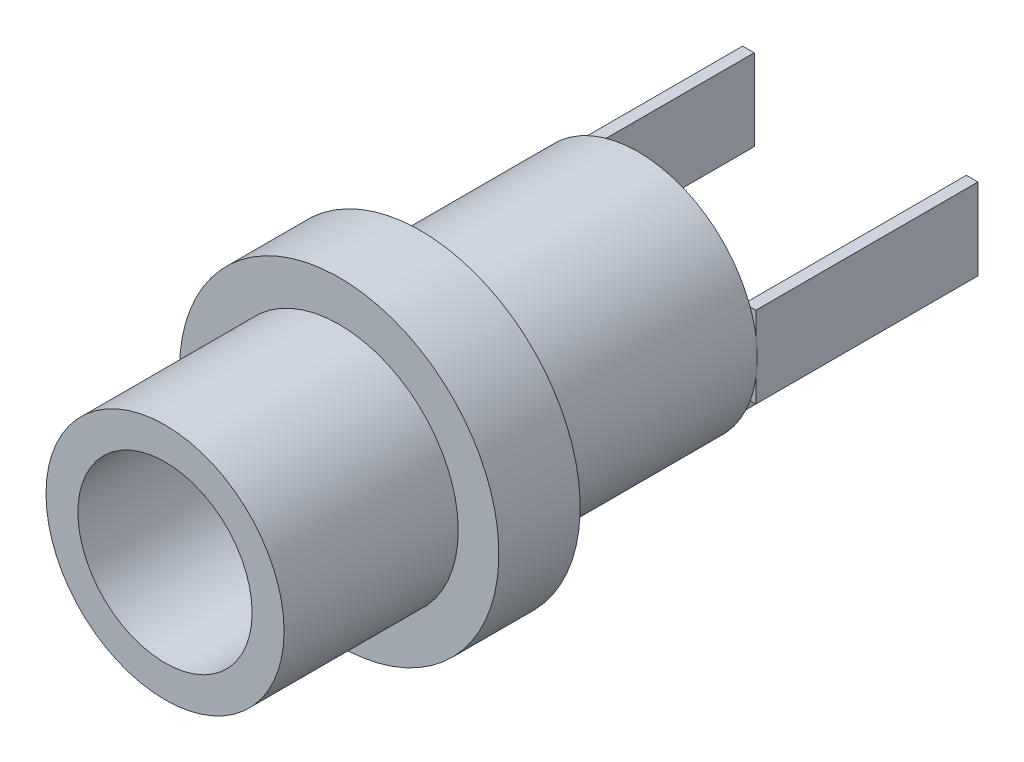
ISO-10303-21;
HEADER;
FILE_DESCRIPTION(('STEP AP214'),'2;1');
FILE_NAME('part.step','',(''),(''),'','','');
FILE_SCHEMA(('AUTOMOTIVE_DESIGN { 1 0 10303 214 1 1 1 1 }'));
ENDSEC;
DATA;
#1=APPLICATION_CONTEXT('core data for automotive mechanical design processes');
#2=APPLICATION_PROTOCOL_DEFINITION('international standard','automotive_design',2000,#1);
#3=PRODUCT_CONTEXT('',#1,'mechanical');
#4=PRODUCT('Part','Part','',(#3));
#5=PRODUCT_RELATED_PRODUCT_CATEGORY('part','',(#4));
#6=PRODUCT_DEFINITION_FORMATION('','',#4);
#7=PRODUCT_DEFINITION_CONTEXT('part definition',#1,'design');
#8=PRODUCT_DEFINITION('design','',#6,#7);
#9=PRODUCT_DEFINITION_SHAPE('','',#8);
#10=(LENGTH_UNIT() NAMED_UNIT(*) SI_UNIT(.MILLI.,.METRE.));
#11=(NAMED_UNIT(*) PLANE_ANGLE_UNIT() SI_UNIT($,.RADIAN.));
#12=(NAMED_UNIT(*) SI_UNIT($,.STERADIAN.) SOLID_ANGLE_UNIT());
#13=UNCERTAINTY_MEASURE_WITH_UNIT(LENGTH_MEASURE(1.E-05),#10,'distance_accuracy_value','');
#14=(GEOMETRIC_REPRESENTATION_CONTEXT(3) GLOBAL_UNCERTAINTY_ASSIGNED_CONTEXT((#13)) GLOBAL_UNIT_ASSIGNED_CONTEXT((#10,
#11,#12)) REPRESENTATION_CONTEXT('',''));
#15=CARTESIAN_POINT('',(0.,0.,0.));
#16=DIRECTION('',(0.,0.,1.));
#17=DIRECTION('',(1.,0.,0.));
#18=AXIS2_PLACEMENT_3D('',#15,#16,#17);
#19=CARTESIAN_POINT('',(0.,0.,-16.3));
#20=DIRECTION('',(0.,0.,-1.));
#21=DIRECTION('',(-1.,0.,0.));
#22=AXIS2_PLACEMENT_3D('',#19,#20,#21);
#23=PLANE('',#22);
#24=DIRECTION('',(0.,1.,0.));
#25=VECTOR('',#24,1.);
#26=CARTESIAN_POINT('',(-4.05356977359954,1.4,-16.3));
#27=LINE('',#26,#25);
#28=CARTESIAN_POINT('',(-4.05356977359954,0.615282122737358,-16.3));
#29=VERTEX_POINT('',#28);
#30=CARTESIAN_POINT('',(-4.05356977359954,-0.615282122737358,-16.3));
#31=VERTEX_POINT('',#30);
#32=EDGE_CURVE('E201',#29,#31,#27,.F.);
#33=ORIENTED_EDGE('',*,*,#32,.T.);
#34=CARTESIAN_POINT('',(0.,0.,-16.3));
#35=DIRECTION('',(0.,0.,-1.));
#36=DIRECTION('',(-1.,0.,0.));
#37=AXIS2_PLACEMENT_3D('',#34,#35,#36);
#38=CIRCLE('',#37,4.1);
#39=EDGE_CURVE('E618',#31,#29,#38,.T.);
#40=ORIENTED_EDGE('',*,*,#39,.T.);
#41=EDGE_LOOP('',(#33,#40));
#42=FACE_BOUND('',#41,.T.);
#43=ADVANCED_FACE('F35',(#42),#23,.T.);
#44=CARTESIAN_POINT('',(0.615282122737358,-4.05356977359954,-16.3));
#45=VERTEX_POINT('',#44);
#46=CARTESIAN_POINT('',(-0.615282122737358,-4.05356977359954,-16.3));
#47=VERTEX_POINT('',#46);
#48=EDGE_CURVE('E623',#45,#47,#38,.T.);
#49=ORIENTED_EDGE('',*,*,#48,.T.);
#50=DIRECTION('',(-1.,0.,0.));
#51=VECTOR('',#50,1.);
#52=CARTESIAN_POINT('',(1.4,-4.05356977359954,-16.3));
#53=LINE('',#52,#51);
#54=EDGE_CURVE('E225',#45,#47,#53,.T.);
#55=ORIENTED_EDGE('',*,*,#54,.F.);
#56=EDGE_LOOP('',(#49,#55));
#57=FACE_BOUND('',#56,.T.);
#58=ADVANCED_FACE('F322',(#57),#23,.T.);
#59=DIRECTION('',(1.,0.,0.));
#60=VECTOR('',#59,1.);
#61=CARTESIAN_POINT('',(-4.05356977359954,-1.4,-16.3));
#62=LINE('',#61,#60);
#63=CARTESIAN_POINT('',(-3.85356977359954,-1.4,-16.3));
#64=VERTEX_POINT('',#63);
#65=CARTESIAN_POINT('',(-3.65356977359954,-1.4,-16.3));
#66=VERTEX_POINT('',#65);
#67=EDGE_CURVE('E54',#64,#66,#62,.T.);
#68=ORIENTED_EDGE('',*,*,#67,.T.);
#69=DIRECTION('',(0.,1.,0.));
#70=VECTOR('',#69,1.);
#71=CARTESIAN_POINT('',(-3.65356977359954,1.4,-16.3));
#72=LINE('',#71,#70);
#73=CARTESIAN_POINT('',(-3.65356977359954,1.4,-16.3));
#74=VERTEX_POINT('',#73);
#75=EDGE_CURVE('E59',#74,#66,#72,.F.);
#76=ORIENTED_EDGE('',*,*,#75,.F.);
#77=DIRECTION('',(-1.,0.,0.));
#78=VECTOR('',#77,1.);
#79=CARTESIAN_POINT('',(-3.65356977359954,1.4,-16.3));
#80=LINE('',#79,#78);
#81=CARTESIAN_POINT('',(-3.85356977359954,1.4,-16.3));
#82=VERTEX_POINT('',#81);
#83=EDGE_CURVE('E175',#74,#82,#80,.T.);
#84=ORIENTED_EDGE('',*,*,#83,.T.);
#85=CARTESIAN_POINT('',(3.85356977359954,1.4,-16.3));
#86=VERTEX_POINT('',#85);
#87=EDGE_CURVE('E274',#82,#86,#38,.T.);
#88=ORIENTED_EDGE('',*,*,#87,.T.);
#89=DIRECTION('',(-1.,0.,0.));
#90=VECTOR('',#89,1.);
#91=CARTESIAN_POINT('',(4.05356977359954,1.4,-16.3));
#92=LINE('',#91,#90);
#93=CARTESIAN_POINT('',(3.65356977359954,1.4,-16.3));
#94=VERTEX_POINT('',#93);
#95=EDGE_CURVE('E44',#86,#94,#92,.T.);
#96=ORIENTED_EDGE('',*,*,#95,.T.);
#97=DIRECTION('',(0.,1.,0.));
#98=VECTOR('',#97,1.);
#99=CARTESIAN_POINT('',(3.65356977359954,1.4,-16.3));
#100=LINE('',#99,#98);
#101=CARTESIAN_POINT('',(3.65356977359954,-1.4,-16.3));
#102=VERTEX_POINT('',#101);
#103=EDGE_CURVE('E261',#94,#102,#100,.F.);
#104=ORIENTED_EDGE('',*,*,#103,.T.);
#105=DIRECTION('',(1.,0.,0.));
#106=VECTOR('',#105,1.);
#107=CARTESIAN_POINT('',(3.65356977359954,-1.4,-16.3));
#108=LINE('',#107,#106);
#109=CARTESIAN_POINT('',(3.85356977359954,-1.4,-16.3));
#110=VERTEX_POINT('',#109);
#111=EDGE_CURVE('E258',#102,#110,#108,.T.);
#112=ORIENTED_EDGE('',*,*,#111,.T.);
#113=CARTESIAN_POINT('',(1.4,-3.85356977359954,-16.3));
#114=VERTEX_POINT('',#113);
#115=EDGE_CURVE('E630',#110,#114,#38,.T.);
#116=ORIENTED_EDGE('',*,*,#115,.T.);
#117=DIRECTION('',(0.,1.,0.));
#118=VECTOR('',#117,1.);
#119=CARTESIAN_POINT('',(1.4,-4.05356977359954,-16.3));
#120=LINE('',#119,#118);
#121=CARTESIAN_POINT('',(1.4,-3.65356977359954,-16.3));
#122=VERTEX_POINT('',#121);
#123=EDGE_CURVE('E230',#114,#122,#120,.T.);
#124=ORIENTED_EDGE('',*,*,#123,.T.);
#125=DIRECTION('',(-1.,0.,0.));
#126=VECTOR('',#125,1.);
#127=CARTESIAN_POINT('',(1.4,-3.65356977359954,-16.3));
#128=LINE('',#127,#126);
#129=CARTESIAN_POINT('',(-1.4,-3.65356977359954,-16.3));
#130=VERTEX_POINT('',#129);
#131=EDGE_CURVE('E228',#122,#130,#128,.T.);
#132=ORIENTED_EDGE('',*,*,#131,.T.);
#133=DIRECTION('',(0.,-1.,0.));
#134=VECTOR('',#133,1.);
#135=CARTESIAN_POINT('',(-1.4,-3.65356977359954,-16.3));
#136=LINE('',#135,#134);
#137=CARTESIAN_POINT('',(-1.4,-3.85356977359954,-16.3));
#138=VERTEX_POINT('',#137);
#139=EDGE_CURVE('E226',#130,#138,#136,.T.);
#140=ORIENTED_EDGE('',*,*,#139,.T.);
#141=EDGE_CURVE('E619',#138,#64,#38,.T.);
#142=ORIENTED_EDGE('',*,*,#141,.T.);
#143=EDGE_LOOP('',(#68,#76,#84,#88,#96,#104,#112,#116,#124,#132,#140,#142));
#144=FACE_BOUND('',#143,.T.);
#145=ADVANCED_FACE('F329',(#144),#23,.T.);
#146=CARTESIAN_POINT('',(0.,0.,-6.));
#147=DIRECTION('',(0.,0.,1.));
#148=DIRECTION('',(1.,0.,0.));
#149=AXIS2_PLACEMENT_3D('',#146,#147,#148);
#150=CYLINDRICAL_SURFACE('',#149,4.1);
#151=CARTESIAN_POINT('',(0.,0.,-6.));
#152=DIRECTION('',(0.,0.,1.));
#153=DIRECTION('',(1.,0.,0.));
#154=AXIS2_PLACEMENT_3D('',#151,#152,#153);
#155=CIRCLE('',#154,4.1);
#156=CARTESIAN_POINT('',(4.1,0.,-6.));
#157=VERTEX_POINT('',#156);
#158=EDGE_CURVE('E285',#157,#157,#155,.T.);
#159=ORIENTED_EDGE('',*,*,#158,.T.);
#160=EDGE_LOOP('',(#159));
#161=FACE_BOUND('',#160,.T.);
#162=CARTESIAN_POINT('',(0.,0.,0.));
#163=DIRECTION('',(0.,0.,1.));
#164=DIRECTION('',(1.,0.,0.));
#165=AXIS2_PLACEMENT_3D('',#162,#163,#164);
#166=CIRCLE('',#165,4.1);
#167=CARTESIAN_POINT('',(4.1,0.,0.));
#168=VERTEX_POINT('',#167);
#169=EDGE_CURVE('E39',#168,#168,#166,.T.);
#170=ORIENTED_EDGE('',*,*,#169,.F.);
#171=EDGE_LOOP('',(#170));
#172=FACE_BOUND('',#171,.T.);
#173=ADVANCED_FACE('F37',(#161,#172),#150,.T.);
#174=CARTESIAN_POINT('',(0.,0.,0.));
#175=DIRECTION('',(0.,0.,1.));
#176=DIRECTION('',(1.,0.,0.));
#177=AXIS2_PLACEMENT_3D('',#174,#175,#176);
#178=PLANE('',#177);
#179=CARTESIAN_POINT('',(0.,0.,0.));
#180=DIRECTION('',(0.,0.,1.));
#181=DIRECTION('',(1.,0.,0.));
#182=AXIS2_PLACEMENT_3D('',#179,#180,#181);
#183=CIRCLE('',#182,3.);
#184=CARTESIAN_POINT('',(3.,0.,0.));
#185=VERTEX_POINT('',#184);
#186=EDGE_CURVE('E291',#185,#185,#183,.T.);
#187=ORIENTED_EDGE('',*,*,#186,.F.);
#188=EDGE_LOOP('',(#187));
#189=FACE_BOUND('',#188,.T.);
#190=ORIENTED_EDGE('',*,*,#169,.T.);
#191=EDGE_LOOP('',(#190));
#192=FACE_BOUND('',#191,.T.);
#193=ADVANCED_FACE('F350',(#189,#192),#178,.T.);
#194=CARTESIAN_POINT('',(0.,0.,-6.));
#195=DIRECTION('',(0.,0.,1.));
#196=DIRECTION('',(1.,0.,0.));
#197=AXIS2_PLACEMENT_3D('',#194,#195,#196);
#198=CYLINDRICAL_SURFACE('',#197,3.);
#199=CARTESIAN_POINT('',(0.,0.,-6.));
#200=DIRECTION('',(0.,0.,1.));
#201=DIRECTION('',(1.,0.,0.));
#202=AXIS2_PLACEMENT_3D('',#199,#200,#201);
#203=CIRCLE('',#202,3.);
#204=CARTESIAN_POINT('',(3.,0.,-6.));
#205=VERTEX_POINT('',#204);
#206=EDGE_CURVE('E288',#205,#205,#203,.T.);
#207=ORIENTED_EDGE('',*,*,#206,.F.);
#208=EDGE_LOOP('',(#207));
#209=FACE_BOUND('',#208,.T.);
#210=ORIENTED_EDGE('',*,*,#186,.T.);
#211=EDGE_LOOP('',(#210));
#212=FACE_BOUND('',#211,.T.);
#213=ADVANCED_FACE('F302',(#209,#212),#198,.F.);
#214=CARTESIAN_POINT('',(0.,0.,-6.));
#215=DIRECTION('',(0.,0.,-1.));
#216=DIRECTION('',(-1.,0.,0.));
#217=AXIS2_PLACEMENT_3D('',#214,#215,#216);
#218=PLANE('',#217);
#219=ORIENTED_EDGE('',*,*,#158,.F.);
#220=EDGE_LOOP('',(#219));
#221=FACE_BOUND('',#220,.T.);
#222=CARTESIAN_POINT('',(0.,0.,-6.));
#223=DIRECTION('',(0.,0.,-1.));
#224=DIRECTION('',(-1.,0.,0.));
#225=AXIS2_PLACEMENT_3D('',#222,#223,#224);
#226=CIRCLE('',#225,5.5);
#227=CARTESIAN_POINT('',(-5.5,0.,-6.));
#228=VERTEX_POINT('',#227);
#229=EDGE_CURVE('E277',#228,#228,#226,.T.);
#230=ORIENTED_EDGE('',*,*,#229,.F.);
#231=EDGE_LOOP('',(#230));
#232=FACE_BOUND('',#231,.T.);
#233=ADVANCED_FACE('F298',(#221,#232),#218,.F.);
#234=CARTESIAN_POINT('',(0.,0.,-8.8));
#235=DIRECTION('',(0.,0.,-1.));
#236=DIRECTION('',(-1.,0.,0.));
#237=AXIS2_PLACEMENT_3D('',#234,#235,#236);
#238=PLANE('',#237);
#239=CARTESIAN_POINT('',(0.,0.,-8.8));
#240=DIRECTION('',(0.,0.,-1.));
#241=DIRECTION('',(-1.,0.,0.));
#242=AXIS2_PLACEMENT_3D('',#239,#240,#241);
#243=CIRCLE('',#242,4.1);
#244=CARTESIAN_POINT('',(-4.1,0.,-8.8));
#245=VERTEX_POINT('',#244);
#246=EDGE_CURVE('E279',#245,#245,#243,.T.);
#247=ORIENTED_EDGE('',*,*,#246,.F.);
#248=EDGE_LOOP('',(#247));
#249=FACE_BOUND('',#248,.T.);
#250=CARTESIAN_POINT('',(0.,0.,-8.8));
#251=DIRECTION('',(0.,0.,-1.));
#252=DIRECTION('',(-1.,0.,0.));
#253=AXIS2_PLACEMENT_3D('',#250,#251,#252);
#254=CIRCLE('',#253,5.5);
#255=CARTESIAN_POINT('',(-5.5,0.,-8.8));
#256=VERTEX_POINT('',#255);
#257=EDGE_CURVE('E282',#256,#256,#254,.T.);
#258=ORIENTED_EDGE('',*,*,#257,.T.);
#259=EDGE_LOOP('',(#258));
#260=FACE_BOUND('',#259,.T.);
#261=ADVANCED_FACE('F301',(#249,#260),#238,.T.);
#262=CARTESIAN_POINT('',(0.,0.,-8.8));
#263=DIRECTION('',(0.,0.,1.));
#264=DIRECTION('',(1.,0.,0.));
#265=AXIS2_PLACEMENT_3D('',#262,#263,#264);
#266=CYLINDRICAL_SURFACE('',#265,5.5);
#267=ORIENTED_EDGE('',*,*,#257,.F.);
#268=EDGE_LOOP('',(#267));
#269=FACE_BOUND('',#268,.T.);
#270=ORIENTED_EDGE('',*,*,#229,.T.);
#271=EDGE_LOOP('',(#270));
#272=FACE_BOUND('',#271,.T.);
#273=ADVANCED_FACE('F307',(#269,#272),#266,.T.);
#274=ORIENTED_EDGE('',*,*,#206,.T.);
#275=EDGE_LOOP('',(#274));
#276=FACE_BOUND('',#275,.T.);
#277=ADVANCED_FACE('F304',(#276),#218,.F.);
#278=CARTESIAN_POINT('',(0.,0.,-16.3));
#279=DIRECTION('',(0.,0.,1.));
#280=DIRECTION('',(1.,0.,0.));
#281=AXIS2_PLACEMENT_3D('',#278,#279,#280);
#282=CYLINDRICAL_SURFACE('',#281,4.1);
#283=CARTESIAN_POINT('',(4.05356977359954,0.615282122737358,-16.3));
#284=VERTEX_POINT('',#283);
#285=EDGE_CURVE('E275',#86,#284,#38,.T.);
#286=ORIENTED_EDGE('',*,*,#285,.F.);
#287=ORIENTED_EDGE('',*,*,#87,.F.);
#288=EDGE_CURVE('E615',#29,#82,#38,.T.);
#289=ORIENTED_EDGE('',*,*,#288,.F.);
#290=ORIENTED_EDGE('',*,*,#39,.F.);
#291=EDGE_CURVE('E603',#64,#31,#38,.T.);
#292=ORIENTED_EDGE('',*,*,#291,.F.);
#293=ORIENTED_EDGE('',*,*,#141,.F.);
#294=EDGE_CURVE('E620',#47,#138,#38,.T.);
#295=ORIENTED_EDGE('',*,*,#294,.F.);
#296=ORIENTED_EDGE('',*,*,#48,.F.);
#297=EDGE_CURVE('E627',#114,#45,#38,.T.);
#298=ORIENTED_EDGE('',*,*,#297,.F.);
#299=ORIENTED_EDGE('',*,*,#115,.F.);
#300=CARTESIAN_POINT('',(4.05356977359954,-0.615282122737358,-16.3));
#301=VERTEX_POINT('',#300);
#302=EDGE_CURVE('E633',#301,#110,#38,.T.);
#303=ORIENTED_EDGE('',*,*,#302,.F.);
#304=EDGE_CURVE('E278',#284,#301,#38,.T.);
#305=ORIENTED_EDGE('',*,*,#304,.F.);
#306=EDGE_LOOP('',(#286,#287,#289,#290,#292,#293,#295,#296,#298,#299,#303,#305));
#307=FACE_BOUND('',#306,.T.);
#308=ORIENTED_EDGE('',*,*,#246,.T.);
#309=EDGE_LOOP('',(#308));
#310=FACE_BOUND('',#309,.T.);
#311=ADVANCED_FACE('F315',(#307,#310),#282,.T.);
#312=DIRECTION('',(0.,1.,0.));
#313=VECTOR('',#312,1.);
#314=CARTESIAN_POINT('',(4.05356977359954,1.4,-16.3));
#315=LINE('',#314,#313);
#316=EDGE_CURVE('E11',#284,#301,#315,.F.);
#317=ORIENTED_EDGE('',*,*,#316,.F.);
#318=ORIENTED_EDGE('',*,*,#304,.T.);
#319=EDGE_LOOP('',(#317,#318));
#320=FACE_BOUND('',#319,.T.);
#321=ADVANCED_FACE('F325',(#320),#23,.T.);
#322=CARTESIAN_POINT('',(0.,0.,-16.3));
#323=DIRECTION('',(0.,0.,-1.));
#324=DIRECTION('',(-1.,0.,0.));
#325=AXIS2_PLACEMENT_3D('',#322,#323,#324);
#326=PLANE('',#325);
#327=CARTESIAN_POINT('',(4.05356977359954,1.4,-16.3));
#328=VERTEX_POINT('',#327);
#329=EDGE_CURVE('E246',#328,#86,#92,.T.);
#330=ORIENTED_EDGE('',*,*,#329,.T.);
#331=ORIENTED_EDGE('',*,*,#285,.T.);
#332=EDGE_CURVE('E46',#328,#284,#315,.F.);
#333=ORIENTED_EDGE('',*,*,#332,.F.);
#334=EDGE_LOOP('',(#330,#331,#333));
#335=FACE_BOUND('',#334,.T.);
#336=ADVANCED_FACE('F335',(#335),#326,.F.);
#337=CARTESIAN_POINT('',(4.05356977359954,-1.4,-16.3));
#338=VERTEX_POINT('',#337);
#339=EDGE_CURVE('E47',#301,#338,#315,.F.);
#340=ORIENTED_EDGE('',*,*,#339,.F.);
#341=ORIENTED_EDGE('',*,*,#302,.T.);
#342=EDGE_CURVE('E257',#110,#338,#108,.T.);
#343=ORIENTED_EDGE('',*,*,#342,.T.);
#344=EDGE_LOOP('',(#340,#341,#343));
#345=FACE_BOUND('',#344,.T.);
#346=ADVANCED_FACE('F341',(#345),#326,.F.);
#347=CARTESIAN_POINT('',(4.05356977359954,1.4,-23.95));
#348=DIRECTION('',(-1.,0.,0.));
#349=DIRECTION('',(0.,0.,1.));
#350=AXIS2_PLACEMENT_3D('',#347,#348,#349);
#351=PLANE('',#350);
#352=ORIENTED_EDGE('',*,*,#332,.T.);
#353=ORIENTED_EDGE('',*,*,#316,.T.);
#354=ORIENTED_EDGE('',*,*,#339,.T.);
#355=DIRECTION('',(0.,0.,1.));
#356=VECTOR('',#355,1.);
#357=CARTESIAN_POINT('',(4.05356977359954,-1.4,-23.95));
#358=LINE('',#357,#356);
#359=CARTESIAN_POINT('',(4.05356977359954,-1.4,-23.95));
#360=VERTEX_POINT('',#359);
#361=EDGE_CURVE('E271',#360,#338,#358,.T.);
#362=ORIENTED_EDGE('',*,*,#361,.F.);
#363=DIRECTION('',(0.,1.,0.));
#364=VECTOR('',#363,1.);
#365=CARTESIAN_POINT('',(4.05356977359954,1.4,-23.95));
#366=LINE('',#365,#364);
#367=CARTESIAN_POINT('',(4.05356977359954,1.4,-23.95));
#368=VERTEX_POINT('',#367);
#369=EDGE_CURVE('E243',#368,#360,#366,.F.);
#370=ORIENTED_EDGE('',*,*,#369,.F.);
#371=DIRECTION('',(0.,0.,1.));
#372=VECTOR('',#371,1.);
#373=CARTESIAN_POINT('',(4.05356977359954,1.4,-23.95));
#374=LINE('',#373,#372);
#375=EDGE_CURVE('E254',#368,#328,#374,.T.);
#376=ORIENTED_EDGE('',*,*,#375,.T.);
#377=EDGE_LOOP('',(#352,#353,#354,#362,#370,#376));
#378=FACE_BOUND('',#377,.T.);
#379=ADVANCED_FACE('F418',(#378),#351,.F.);
#380=CARTESIAN_POINT('',(3.65356977359954,-1.4,-23.95));
#381=DIRECTION('',(0.,-1.,0.));
#382=DIRECTION('',(0.,0.,-1.));
#383=AXIS2_PLACEMENT_3D('',#380,#381,#382);
#384=PLANE('',#383);
#385=ORIENTED_EDGE('',*,*,#111,.F.);
#386=DIRECTION('',(0.,0.,1.));
#387=VECTOR('',#386,1.);
#388=CARTESIAN_POINT('',(3.65356977359954,-1.4,-23.95));
#389=LINE('',#388,#387);
#390=CARTESIAN_POINT('',(3.65356977359954,-1.4,-23.95));
#391=VERTEX_POINT('',#390);
#392=EDGE_CURVE('E269',#391,#102,#389,.T.);
#393=ORIENTED_EDGE('',*,*,#392,.F.);
#394=DIRECTION('',(1.,0.,0.));
#395=VECTOR('',#394,1.);
#396=CARTESIAN_POINT('',(3.65356977359954,-1.4,-23.95));
#397=LINE('',#396,#395);
#398=EDGE_CURVE('E245',#391,#360,#397,.T.);
#399=ORIENTED_EDGE('',*,*,#398,.T.);
#400=ORIENTED_EDGE('',*,*,#361,.T.);
#401=ORIENTED_EDGE('',*,*,#342,.F.);
#402=EDGE_LOOP('',(#385,#393,#399,#400,#401));
#403=FACE_BOUND('',#402,.T.);
#404=ADVANCED_FACE('F427',(#403),#384,.T.);
#405=CARTESIAN_POINT('',(3.65356977359954,1.4,-23.95));
#406=DIRECTION('',(-1.,0.,0.));
#407=DIRECTION('',(0.,0.,1.));
#408=AXIS2_PLACEMENT_3D('',#405,#406,#407);
#409=PLANE('',#408);
#410=ORIENTED_EDGE('',*,*,#103,.F.);
#411=DIRECTION('',(0.,0.,1.));
#412=VECTOR('',#411,1.);
#413=CARTESIAN_POINT('',(3.65356977359954,1.4,-23.95));
#414=LINE('',#413,#412);
#415=CARTESIAN_POINT('',(3.65356977359954,1.4,-23.95));
#416=VERTEX_POINT('',#415);
#417=EDGE_CURVE('E267',#416,#94,#414,.T.);
#418=ORIENTED_EDGE('',*,*,#417,.F.);
#419=DIRECTION('',(0.,1.,0.));
#420=VECTOR('',#419,1.);
#421=CARTESIAN_POINT('',(3.65356977359954,1.4,-23.95));
#422=LINE('',#421,#420);
#423=EDGE_CURVE('E249',#416,#391,#422,.F.);
#424=ORIENTED_EDGE('',*,*,#423,.T.);
#425=ORIENTED_EDGE('',*,*,#392,.T.);
#426=EDGE_LOOP('',(#410,#418,#424,#425));
#427=FACE_BOUND('',#426,.T.);
#428=ADVANCED_FACE('F436',(#427),#409,.T.);
#429=CARTESIAN_POINT('',(4.05356977359954,1.4,-23.95));
#430=DIRECTION('',(0.,1.,0.));
#431=DIRECTION('',(0.,0.,1.));
#432=AXIS2_PLACEMENT_3D('',#429,#430,#431);
#433=PLANE('',#432);
#434=ORIENTED_EDGE('',*,*,#329,.F.);
#435=ORIENTED_EDGE('',*,*,#375,.F.);
#436=DIRECTION('',(-1.,0.,0.));
#437=VECTOR('',#436,1.);
#438=CARTESIAN_POINT('',(4.05356977359954,1.4,-23.95));
#439=LINE('',#438,#437);
#440=EDGE_CURVE('E252',#368,#416,#439,.T.);
#441=ORIENTED_EDGE('',*,*,#440,.T.);
#442=ORIENTED_EDGE('',*,*,#417,.T.);
#443=ORIENTED_EDGE('',*,*,#95,.F.);
#444=EDGE_LOOP('',(#434,#435,#441,#442,#443));
#445=FACE_BOUND('',#444,.T.);
#446=ADVANCED_FACE('F446',(#445),#433,.T.);
#447=CARTESIAN_POINT('',(0.,0.,-23.95));
#448=DIRECTION('',(0.,0.,-1.));
#449=DIRECTION('',(-1.,0.,0.));
#450=AXIS2_PLACEMENT_3D('',#447,#448,#449);
#451=PLANE('',#450);
#452=ORIENTED_EDGE('',*,*,#369,.T.);
#453=ORIENTED_EDGE('',*,*,#398,.F.);
#454=ORIENTED_EDGE('',*,*,#423,.F.);
#455=ORIENTED_EDGE('',*,*,#440,.F.);
#456=EDGE_LOOP('',(#452,#453,#454,#455));
#457=FACE_BOUND('',#456,.T.);
#458=ADVANCED_FACE('F456',(#457),#451,.T.);
#459=CARTESIAN_POINT('',(0.,0.,-16.3));
#460=DIRECTION('',(0.,0.,1.));
#461=DIRECTION('',(1.,0.,0.));
#462=AXIS2_PLACEMENT_3D('',#459,#460,#461);
#463=PLANE('',#462);
#464=ORIENTED_EDGE('',*,*,#294,.T.);
#465=CARTESIAN_POINT('',(-1.4,-4.05356977359954,-16.3));
#466=VERTEX_POINT('',#465);
#467=EDGE_CURVE('E224',#138,#466,#136,.T.);
#468=ORIENTED_EDGE('',*,*,#467,.T.);
#469=EDGE_CURVE('E180',#47,#466,#53,.T.);
#470=ORIENTED_EDGE('',*,*,#469,.F.);
#471=EDGE_LOOP('',(#464,#468,#470));
#472=FACE_BOUND('',#471,.T.);
#473=ADVANCED_FACE('F466',(#472),#463,.T.);
#474=CARTESIAN_POINT('',(1.4,-4.05356977359954,-23.95));
#475=DIRECTION('',(0.,1.,0.));
#476=DIRECTION('',(0.,0.,1.));
#477=AXIS2_PLACEMENT_3D('',#474,#475,#476);
#478=PLANE('',#477);
#479=CARTESIAN_POINT('',(1.4,-4.05356977359954,-16.3));
#480=VERTEX_POINT('',#479);
#481=EDGE_CURVE('E221',#480,#45,#53,.T.);
#482=ORIENTED_EDGE('',*,*,#481,.T.);
#483=ORIENTED_EDGE('',*,*,#54,.T.);
#484=ORIENTED_EDGE('',*,*,#469,.T.);
#485=DIRECTION('',(0.,0.,1.));
#486=VECTOR('',#485,1.);
#487=CARTESIAN_POINT('',(-1.4,-4.05356977359954,-23.95));
#488=LINE('',#487,#486);
#489=CARTESIAN_POINT('',(-1.4,-4.05356977359954,-23.95));
#490=VERTEX_POINT('',#489);
#491=EDGE_CURVE('E240',#490,#466,#488,.T.);
#492=ORIENTED_EDGE('',*,*,#491,.F.);
#493=DIRECTION('',(-1.,0.,0.));
#494=VECTOR('',#493,1.);
#495=CARTESIAN_POINT('',(1.4,-4.05356977359954,-23.95));
#496=LINE('',#495,#494);
#497=CARTESIAN_POINT('',(1.4,-4.05356977359954,-23.95));
#498=VERTEX_POINT('',#497);
#499=EDGE_CURVE('E208',#498,#490,#496,.T.);
#500=ORIENTED_EDGE('',*,*,#499,.F.);
#501=DIRECTION('',(0.,0.,1.));
#502=VECTOR('',#501,1.);
#503=CARTESIAN_POINT('',(1.4,-4.05356977359954,-23.95));
#504=LINE('',#503,#502);
#505=EDGE_CURVE('E220',#498,#480,#504,.T.);
#506=ORIENTED_EDGE('',*,*,#505,.T.);
#507=EDGE_LOOP('',(#482,#483,#484,#492,#500,#506));
#508=FACE_BOUND('',#507,.T.);
#509=ADVANCED_FACE('F476',(#508),#478,.F.);
#510=CARTESIAN_POINT('',(-1.4,-3.65356977359954,-23.95));
#511=DIRECTION('',(-1.,0.,0.));
#512=DIRECTION('',(0.,0.,1.));
#513=AXIS2_PLACEMENT_3D('',#510,#511,#512);
#514=PLANE('',#513);
#515=ORIENTED_EDGE('',*,*,#139,.F.);
#516=DIRECTION('',(0.,0.,1.));
#517=VECTOR('',#516,1.);
#518=CARTESIAN_POINT('',(-1.4,-3.65356977359954,-23.95));
#519=LINE('',#518,#517);
#520=CARTESIAN_POINT('',(-1.4,-3.65356977359954,-23.95));
#521=VERTEX_POINT('',#520);
#522=EDGE_CURVE('E237',#521,#130,#519,.T.);
#523=ORIENTED_EDGE('',*,*,#522,.F.);
#524=DIRECTION('',(0.,-1.,0.));
#525=VECTOR('',#524,1.);
#526=CARTESIAN_POINT('',(-1.4,-3.65356977359954,-23.95));
#527=LINE('',#526,#525);
#528=EDGE_CURVE('E210',#521,#490,#527,.T.);
#529=ORIENTED_EDGE('',*,*,#528,.T.);
#530=ORIENTED_EDGE('',*,*,#491,.T.);
#531=ORIENTED_EDGE('',*,*,#467,.F.);
#532=EDGE_LOOP('',(#515,#523,#529,#530,#531));
#533=FACE_BOUND('',#532,.T.);
#534=ADVANCED_FACE('F487',(#533),#514,.T.);
#535=CARTESIAN_POINT('',(1.4,-3.65356977359954,-23.95));
#536=DIRECTION('',(0.,1.,0.));
#537=DIRECTION('',(0.,0.,1.));
#538=AXIS2_PLACEMENT_3D('',#535,#536,#537);
#539=PLANE('',#538);
#540=ORIENTED_EDGE('',*,*,#131,.F.);
#541=DIRECTION('',(0.,0.,1.));
#542=VECTOR('',#541,1.);
#543=CARTESIAN_POINT('',(1.4,-3.65356977359954,-23.95));
#544=LINE('',#543,#542);
#545=CARTESIAN_POINT('',(1.4,-3.65356977359954,-23.95));
#546=VERTEX_POINT('',#545);
#547=EDGE_CURVE('E234',#546,#122,#544,.T.);
#548=ORIENTED_EDGE('',*,*,#547,.F.);
#549=DIRECTION('',(-1.,0.,0.));
#550=VECTOR('',#549,1.);
#551=CARTESIAN_POINT('',(1.4,-3.65356977359954,-23.95));
#552=LINE('',#551,#550);
#553=EDGE_CURVE('E214',#546,#521,#552,.T.);
#554=ORIENTED_EDGE('',*,*,#553,.T.);
#555=ORIENTED_EDGE('',*,*,#522,.T.);
#556=EDGE_LOOP('',(#540,#548,#554,#555));
#557=FACE_BOUND('',#556,.T.);
#558=ADVANCED_FACE('F497',(#557),#539,.T.);
#559=CARTESIAN_POINT('',(1.4,-4.05356977359954,-23.95));
#560=DIRECTION('',(1.,0.,0.));
#561=DIRECTION('',(0.,0.,-1.));
#562=AXIS2_PLACEMENT_3D('',#559,#560,#561);
#563=PLANE('',#562);
#564=EDGE_CURVE('E211',#480,#114,#120,.T.);
#565=ORIENTED_EDGE('',*,*,#564,.F.);
#566=ORIENTED_EDGE('',*,*,#505,.F.);
#567=DIRECTION('',(0.,1.,0.));
#568=VECTOR('',#567,1.);
#569=CARTESIAN_POINT('',(1.4,-4.05356977359954,-23.95));
#570=LINE('',#569,#568);
#571=EDGE_CURVE('E217',#498,#546,#570,.T.);
#572=ORIENTED_EDGE('',*,*,#571,.T.);
#573=ORIENTED_EDGE('',*,*,#547,.T.);
#574=ORIENTED_EDGE('',*,*,#123,.F.);
#575=EDGE_LOOP('',(#565,#566,#572,#573,#574));
#576=FACE_BOUND('',#575,.T.);
#577=ADVANCED_FACE('F507',(#576),#563,.T.);
#578=CARTESIAN_POINT('',(0.,0.,-23.95));
#579=DIRECTION('',(0.,0.,1.));
#580=DIRECTION('',(1.,0.,0.));
#581=AXIS2_PLACEMENT_3D('',#578,#579,#580);
#582=PLANE('',#581);
#583=ORIENTED_EDGE('',*,*,#499,.T.);
#584=ORIENTED_EDGE('',*,*,#528,.F.);
#585=ORIENTED_EDGE('',*,*,#553,.F.);
#586=ORIENTED_EDGE('',*,*,#571,.F.);
#587=EDGE_LOOP('',(#583,#584,#585,#586));
#588=FACE_BOUND('',#587,.T.);
#589=ADVANCED_FACE('F517',(#588),#582,.F.);
#590=ORIENTED_EDGE('',*,*,#297,.T.);
#591=ORIENTED_EDGE('',*,*,#481,.F.);
#592=ORIENTED_EDGE('',*,*,#564,.T.);
#593=EDGE_LOOP('',(#590,#591,#592));
#594=FACE_BOUND('',#593,.T.);
#595=ADVANCED_FACE('F479',(#594),#463,.T.);
#596=CARTESIAN_POINT('',(0.,0.,-16.3));
#597=DIRECTION('',(0.,0.,-1.));
#598=DIRECTION('',(-1.,0.,0.));
#599=AXIS2_PLACEMENT_3D('',#596,#597,#598);
#600=PLANE('',#599);
#601=CARTESIAN_POINT('',(-4.05356977359954,1.4,-16.3));
#602=VERTEX_POINT('',#601);
#603=EDGE_CURVE('E197',#602,#29,#27,.F.);
#604=ORIENTED_EDGE('',*,*,#603,.T.);
#605=ORIENTED_EDGE('',*,*,#288,.T.);
#606=EDGE_CURVE('E200',#82,#602,#80,.T.);
#607=ORIENTED_EDGE('',*,*,#606,.T.);
#608=EDGE_LOOP('',(#604,#605,#607));
#609=FACE_BOUND('',#608,.T.);
#610=ADVANCED_FACE('F536',(#609),#600,.F.);
#611=CARTESIAN_POINT('',(-3.65356977359954,1.4,-23.95));
#612=DIRECTION('',(-1.,0.,0.));
#613=DIRECTION('',(0.,0.,1.));
#614=AXIS2_PLACEMENT_3D('',#611,#612,#613);
#615=PLANE('',#614);
#616=ORIENTED_EDGE('',*,*,#75,.T.);
#617=DIRECTION('',(0.,0.,1.));
#618=VECTOR('',#617,1.);
#619=CARTESIAN_POINT('',(-3.65356977359954,-1.4,-23.95));
#620=LINE('',#619,#618);
#621=CARTESIAN_POINT('',(-3.65356977359954,-1.4,-23.95));
#622=VERTEX_POINT('',#621);
#623=EDGE_CURVE('E177',#622,#66,#620,.T.);
#624=ORIENTED_EDGE('',*,*,#623,.F.);
#625=DIRECTION('',(0.,1.,0.));
#626=VECTOR('',#625,1.);
#627=CARTESIAN_POINT('',(-3.65356977359954,1.4,-23.95));
#628=LINE('',#627,#626);
#629=CARTESIAN_POINT('',(-3.65356977359954,1.4,-23.95));
#630=VERTEX_POINT('',#629);
#631=EDGE_CURVE('E165',#630,#622,#628,.F.);
#632=ORIENTED_EDGE('',*,*,#631,.F.);
#633=DIRECTION('',(0.,0.,1.));
#634=VECTOR('',#633,1.);
#635=CARTESIAN_POINT('',(-3.65356977359954,1.4,-23.95));
#636=LINE('',#635,#634);
#637=EDGE_CURVE('E191',#630,#74,#636,.T.);
#638=ORIENTED_EDGE('',*,*,#637,.T.);
#639=EDGE_LOOP('',(#616,#624,#632,#638));
#640=FACE_BOUND('',#639,.T.);
#641=ADVANCED_FACE('F178',(#640),#615,.F.);
#642=CARTESIAN_POINT('',(-4.05356977359954,-1.4,-23.95));
#643=DIRECTION('',(0.,-1.,0.));
#644=DIRECTION('',(0.,0.,-1.));
#645=AXIS2_PLACEMENT_3D('',#642,#643,#644);
#646=PLANE('',#645);
#647=CARTESIAN_POINT('',(-4.05356977359954,-1.4,-16.3));
#648=VERTEX_POINT('',#647);
#649=EDGE_CURVE('E193',#648,#64,#62,.T.);
#650=ORIENTED_EDGE('',*,*,#649,.F.);
#651=DIRECTION('',(0.,0.,1.));
#652=VECTOR('',#651,1.);
#653=CARTESIAN_POINT('',(-4.05356977359954,-1.4,-23.95));
#654=LINE('',#653,#652);
#655=CARTESIAN_POINT('',(-4.05356977359954,-1.4,-23.95));
#656=VERTEX_POINT('',#655);
#657=EDGE_CURVE('E181',#656,#648,#654,.T.);
#658=ORIENTED_EDGE('',*,*,#657,.F.);
#659=DIRECTION('',(1.,0.,0.));
#660=VECTOR('',#659,1.);
#661=CARTESIAN_POINT('',(-4.05356977359954,-1.4,-23.95));
#662=LINE('',#661,#660);
#663=EDGE_CURVE('E170',#656,#622,#662,.T.);
#664=ORIENTED_EDGE('',*,*,#663,.T.);
#665=ORIENTED_EDGE('',*,*,#623,.T.);
#666=ORIENTED_EDGE('',*,*,#67,.F.);
#667=EDGE_LOOP('',(#650,#658,#664,#665,#666));
#668=FACE_BOUND('',#667,.T.);
#669=ADVANCED_FACE('F184',(#668),#646,.T.);
#670=CARTESIAN_POINT('',(-4.05356977359954,1.4,-23.95));
#671=DIRECTION('',(-1.,0.,0.));
#672=DIRECTION('',(0.,0.,1.));
#673=AXIS2_PLACEMENT_3D('',#670,#671,#672);
#674=PLANE('',#673);
#675=ORIENTED_EDGE('',*,*,#603,.F.);
#676=DIRECTION('',(0.,0.,1.));
#677=VECTOR('',#676,1.);
#678=CARTESIAN_POINT('',(-4.05356977359954,1.4,-23.95));
#679=LINE('',#678,#677);
#680=CARTESIAN_POINT('',(-4.05356977359954,1.4,-23.95));
#681=VERTEX_POINT('',#680);
#682=EDGE_CURVE('E204',#681,#602,#679,.T.);
#683=ORIENTED_EDGE('',*,*,#682,.F.);
#684=DIRECTION('',(0.,1.,0.));
#685=VECTOR('',#684,1.);
#686=CARTESIAN_POINT('',(-4.05356977359954,1.4,-23.95));
#687=LINE('',#686,#685);
#688=EDGE_CURVE('E186',#681,#656,#687,.F.);
#689=ORIENTED_EDGE('',*,*,#688,.T.);
#690=ORIENTED_EDGE('',*,*,#657,.T.);
#691=EDGE_CURVE('E196',#31,#648,#27,.F.);
#692=ORIENTED_EDGE('',*,*,#691,.F.);
#693=ORIENTED_EDGE('',*,*,#32,.F.);
#694=EDGE_LOOP('',(#675,#683,#689,#690,#692,#693));
#695=FACE_BOUND('',#694,.T.);
#696=ADVANCED_FACE('F563',(#695),#674,.T.);
#697=CARTESIAN_POINT('',(-3.65356977359954,1.4,-23.95));
#698=DIRECTION('',(0.,1.,0.));
#699=DIRECTION('',(0.,0.,1.));
#700=AXIS2_PLACEMENT_3D('',#697,#698,#699);
#701=PLANE('',#700);
#702=ORIENTED_EDGE('',*,*,#83,.F.);
#703=ORIENTED_EDGE('',*,*,#637,.F.);
#704=DIRECTION('',(-1.,0.,0.));
#705=VECTOR('',#704,1.);
#706=CARTESIAN_POINT('',(-3.65356977359954,1.4,-23.95));
#707=LINE('',#706,#705);
#708=EDGE_CURVE('E173',#630,#681,#707,.T.);
#709=ORIENTED_EDGE('',*,*,#708,.T.);
#710=ORIENTED_EDGE('',*,*,#682,.T.);
#711=ORIENTED_EDGE('',*,*,#606,.F.);
#712=EDGE_LOOP('',(#702,#703,#709,#710,#711));
#713=FACE_BOUND('',#712,.T.);
#714=ADVANCED_FACE('F572',(#713),#701,.T.);
#715=CARTESIAN_POINT('',(0.,0.,-23.95));
#716=DIRECTION('',(0.,0.,-1.));
#717=DIRECTION('',(-1.,0.,0.));
#718=AXIS2_PLACEMENT_3D('',#715,#716,#717);
#719=PLANE('',#718);
#720=ORIENTED_EDGE('',*,*,#631,.T.);
#721=ORIENTED_EDGE('',*,*,#663,.F.);
#722=ORIENTED_EDGE('',*,*,#688,.F.);
#723=ORIENTED_EDGE('',*,*,#708,.F.);
#724=EDGE_LOOP('',(#720,#721,#722,#723));
#725=FACE_BOUND('',#724,.T.);
#726=ADVANCED_FACE('F167',(#725),#719,.T.);
#727=ORIENTED_EDGE('',*,*,#649,.T.);
#728=ORIENTED_EDGE('',*,*,#291,.T.);
#729=ORIENTED_EDGE('',*,*,#691,.T.);
#730=EDGE_LOOP('',(#727,#728,#729));
#731=FACE_BOUND('',#730,.T.);
#732=ADVANCED_FACE('F547',(#731),#600,.F.);
#733=CLOSED_SHELL('',(#43,#58,#145,#173,#193,#213,#233,#261,#273,#277,#311,#321,#336,#346,#379,
#404,#428,#446,#458,#473,#509,#534,#558,#577,#589,#595,#610,#641,#669,#696,#714,#726,#732));
#734=MANIFOLD_SOLID_BREP('B2',#733);
#735=ADVANCED_BREP_SHAPE_REPRESENTATION('',(#18,#734),#14);
#736=SHAPE_DEFINITION_REPRESENTATION(#9,#735);
ENDSEC;
END-ISO-10303-21;
